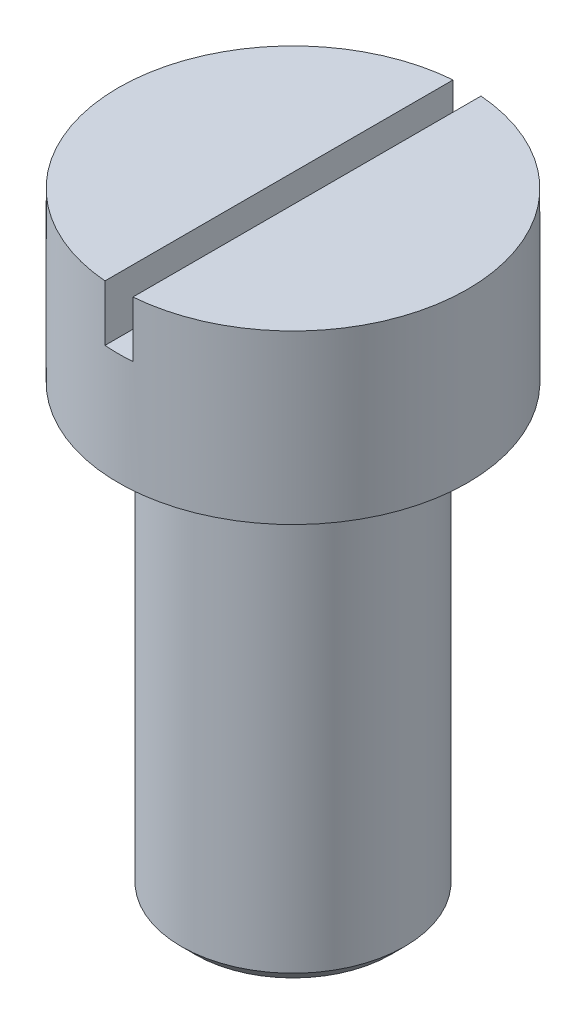
ISO-10303-21;
HEADER;
FILE_DESCRIPTION(('STEP AP214'),'2;1');
FILE_NAME('part.step','',(''),(''),'','','');
FILE_SCHEMA(('AUTOMOTIVE_DESIGN { 1 0 10303 214 1 1 1 1 }'));
ENDSEC;
DATA;
#1=APPLICATION_CONTEXT('core data for automotive mechanical design processes');
#2=APPLICATION_PROTOCOL_DEFINITION('international standard','automotive_design',2000,#1);
#3=PRODUCT_CONTEXT('',#1,'mechanical');
#4=PRODUCT('Part','Part','',(#3));
#5=PRODUCT_RELATED_PRODUCT_CATEGORY('part','',(#4));
#6=PRODUCT_DEFINITION_FORMATION('','',#4);
#7=PRODUCT_DEFINITION_CONTEXT('part definition',#1,'design');
#8=PRODUCT_DEFINITION('design','',#6,#7);
#9=PRODUCT_DEFINITION_SHAPE('','',#8);
#10=(LENGTH_UNIT() NAMED_UNIT(*) SI_UNIT(.MILLI.,.METRE.));
#11=(NAMED_UNIT(*) PLANE_ANGLE_UNIT() SI_UNIT($,.RADIAN.));
#12=(NAMED_UNIT(*) SI_UNIT($,.STERADIAN.) SOLID_ANGLE_UNIT());
#13=UNCERTAINTY_MEASURE_WITH_UNIT(LENGTH_MEASURE(1.E-05),#10,'distance_accuracy_value','');
#14=(GEOMETRIC_REPRESENTATION_CONTEXT(3) GLOBAL_UNCERTAINTY_ASSIGNED_CONTEXT((#13)) GLOBAL_UNIT_ASSIGNED_CONTEXT((#10,
#11,#12)) REPRESENTATION_CONTEXT('',''));
#15=CARTESIAN_POINT('',(0.,0.,0.));
#16=DIRECTION('',(0.,0.,1.));
#17=DIRECTION('',(1.,0.,0.));
#18=AXIS2_PLACEMENT_3D('',#15,#16,#17);
#19=CARTESIAN_POINT('',(12.5,44.,0.));
#20=DIRECTION('',(0.,-1.,0.));
#21=DIRECTION('',(1.,0.,0.));
#22=AXIS2_PLACEMENT_3D('',#19,#20,#21);
#23=PLANE('',#22);
#24=CARTESIAN_POINT('',(0.,44.,0.));
#25=DIRECTION('',(0.,1.,0.));
#26=DIRECTION('',(-1.,0.,0.));
#27=AXIS2_PLACEMENT_3D('',#24,#25,#26);
#28=CIRCLE('',#27,12.5);
#29=CARTESIAN_POINT('',(1.,44.,12.4599357943771));
#30=VERTEX_POINT('',#29);
#31=CARTESIAN_POINT('',(1.,44.,-12.4599357943771));
#32=VERTEX_POINT('',#31);
#33=EDGE_CURVE('E102',#30,#32,#28,.T.);
#34=ORIENTED_EDGE('',*,*,#33,.T.);
#35=DIRECTION('',(0.,0.,1.));
#36=VECTOR('',#35,1.);
#37=CARTESIAN_POINT('',(0.999999999999999,44.,0.));
#38=LINE('',#37,#36);
#39=EDGE_CURVE('E91',#32,#30,#38,.T.);
#40=ORIENTED_EDGE('',*,*,#39,.T.);
#41=EDGE_LOOP('',(#34,#40));
#42=FACE_BOUND('',#41,.T.);
#43=ADVANCED_FACE('F44',(#42),#23,.F.);
#44=CARTESIAN_POINT('',(0.,0.,0.));
#45=DIRECTION('',(0.,1.,0.));
#46=DIRECTION('',(-1.,0.,0.));
#47=AXIS2_PLACEMENT_3D('',#44,#45,#46);
#48=PLANE('',#47);
#49=CARTESIAN_POINT('',(0.,0.,0.));
#50=DIRECTION('',(0.,1.,0.));
#51=DIRECTION('',(-1.,0.,0.));
#52=AXIS2_PLACEMENT_3D('',#49,#50,#51);
#53=CIRCLE('',#52,7.);
#54=CARTESIAN_POINT('',(-7.,0.,0.));
#55=VERTEX_POINT('',#54);
#56=EDGE_CURVE('E92',#55,#55,#53,.F.);
#57=ORIENTED_EDGE('',*,*,#56,.T.);
#58=EDGE_LOOP('',(#57));
#59=FACE_BOUND('',#58,.T.);
#60=ADVANCED_FACE('F142',(#59),#48,.F.);
#61=CARTESIAN_POINT('',(0.,44.,0.));
#62=DIRECTION('',(0.,1.,0.));
#63=DIRECTION('',(-1.,0.,0.));
#64=AXIS2_PLACEMENT_3D('',#61,#62,#63);
#65=CYLINDRICAL_SURFACE('',#64,8.);
#66=CARTESIAN_POINT('',(0.,1.,0.));
#67=DIRECTION('',(0.,1.,0.));
#68=DIRECTION('',(-1.,0.,0.));
#69=AXIS2_PLACEMENT_3D('',#66,#67,#68);
#70=CIRCLE('',#69,8.);
#71=CARTESIAN_POINT('',(-8.,1.,0.));
#72=VERTEX_POINT('',#71);
#73=EDGE_CURVE('E115',#72,#72,#70,.T.);
#74=ORIENTED_EDGE('',*,*,#73,.T.);
#75=EDGE_LOOP('',(#74));
#76=FACE_BOUND('',#75,.T.);
#77=CARTESIAN_POINT('',(0.,32.,0.));
#78=DIRECTION('',(0.,1.,0.));
#79=DIRECTION('',(-1.,0.,0.));
#80=AXIS2_PLACEMENT_3D('',#77,#78,#79);
#81=CIRCLE('',#80,8.);
#82=CARTESIAN_POINT('',(-8.,32.,0.));
#83=VERTEX_POINT('',#82);
#84=EDGE_CURVE('E112',#83,#83,#81,.T.);
#85=ORIENTED_EDGE('',*,*,#84,.F.);
#86=EDGE_LOOP('',(#85));
#87=FACE_BOUND('',#86,.T.);
#88=ADVANCED_FACE('F147',(#76,#87),#65,.T.);
#89=CARTESIAN_POINT('',(8.,32.,0.));
#90=DIRECTION('',(0.,1.,0.));
#91=DIRECTION('',(-1.,0.,0.));
#92=AXIS2_PLACEMENT_3D('',#89,#90,#91);
#93=PLANE('',#92);
#94=CARTESIAN_POINT('',(0.,32.,0.));
#95=DIRECTION('',(0.,1.,0.));
#96=DIRECTION('',(-1.,0.,0.));
#97=AXIS2_PLACEMENT_3D('',#94,#95,#96);
#98=CIRCLE('',#97,12.5);
#99=CARTESIAN_POINT('',(-12.5,32.,0.));
#100=VERTEX_POINT('',#99);
#101=EDGE_CURVE('E106',#100,#100,#98,.T.);
#102=ORIENTED_EDGE('',*,*,#101,.F.);
#103=EDGE_LOOP('',(#102));
#104=FACE_BOUND('',#103,.T.);
#105=ORIENTED_EDGE('',*,*,#84,.T.);
#106=EDGE_LOOP('',(#105));
#107=FACE_BOUND('',#106,.T.);
#108=ADVANCED_FACE('F154',(#104,#107),#93,.F.);
#109=CARTESIAN_POINT('',(0.,44.,0.));
#110=DIRECTION('',(0.,1.,0.));
#111=DIRECTION('',(-1.,0.,0.));
#112=AXIS2_PLACEMENT_3D('',#109,#110,#111);
#113=CYLINDRICAL_SURFACE('',#112,12.5);
#114=ORIENTED_EDGE('',*,*,#33,.F.);
#115=DIRECTION('',(0.,1.,0.));
#116=VECTOR('',#115,1.);
#117=CARTESIAN_POINT('',(1.,44.,12.4599357943771));
#118=LINE('',#117,#116);
#119=CARTESIAN_POINT('',(1.,40.,12.4599357943771));
#120=VERTEX_POINT('',#119);
#121=EDGE_CURVE('E99',#30,#120,#118,.F.);
#122=ORIENTED_EDGE('',*,*,#121,.T.);
#123=CARTESIAN_POINT('',(0.,40.,0.));
#124=DIRECTION('',(0.,-1.,0.));
#125=DIRECTION('',(0.,0.,-1.));
#126=AXIS2_PLACEMENT_3D('',#123,#124,#125);
#127=CIRCLE('',#126,12.5);
#128=CARTESIAN_POINT('',(-1.,40.,12.4599357943771));
#129=VERTEX_POINT('',#128);
#130=EDGE_CURVE('E11',#120,#129,#127,.T.);
#131=ORIENTED_EDGE('',*,*,#130,.T.);
#132=DIRECTION('',(0.,1.,0.));
#133=VECTOR('',#132,1.);
#134=CARTESIAN_POINT('',(-1.,44.,12.4599357943771));
#135=LINE('',#134,#133);
#136=CARTESIAN_POINT('',(-1.,44.,12.4599357943771));
#137=VERTEX_POINT('',#136);
#138=EDGE_CURVE('E86',#129,#137,#135,.T.);
#139=ORIENTED_EDGE('',*,*,#138,.T.);
#140=CARTESIAN_POINT('',(-1.,44.,-12.4599357943771));
#141=VERTEX_POINT('',#140);
#142=EDGE_CURVE('E97',#141,#137,#28,.T.);
#143=ORIENTED_EDGE('',*,*,#142,.F.);
#144=DIRECTION('',(0.,1.,0.));
#145=VECTOR('',#144,1.);
#146=CARTESIAN_POINT('',(-1.,44.,-12.4599357943771));
#147=LINE('',#146,#145);
#148=CARTESIAN_POINT('',(-1.,40.,-12.4599357943771));
#149=VERTEX_POINT('',#148);
#150=EDGE_CURVE('E60',#141,#149,#147,.F.);
#151=ORIENTED_EDGE('',*,*,#150,.T.);
#152=CARTESIAN_POINT('',(1.,40.,-12.4599357943771));
#153=VERTEX_POINT('',#152);
#154=EDGE_CURVE('E49',#149,#153,#127,.T.);
#155=ORIENTED_EDGE('',*,*,#154,.T.);
#156=DIRECTION('',(0.,1.,0.));
#157=VECTOR('',#156,1.);
#158=CARTESIAN_POINT('',(1.,44.,-12.4599357943771));
#159=LINE('',#158,#157);
#160=EDGE_CURVE('E103',#153,#32,#159,.T.);
#161=ORIENTED_EDGE('',*,*,#160,.T.);
#162=EDGE_LOOP('',(#114,#122,#131,#139,#143,#151,#155,#161));
#163=FACE_BOUND('',#162,.T.);
#164=ORIENTED_EDGE('',*,*,#101,.T.);
#165=EDGE_LOOP('',(#164));
#166=FACE_BOUND('',#165,.T.);
#167=ADVANCED_FACE('F95',(#163,#166),#113,.T.);
#168=ORIENTED_EDGE('',*,*,#142,.T.);
#169=DIRECTION('',(0.,0.,-1.));
#170=VECTOR('',#169,1.);
#171=CARTESIAN_POINT('',(-1.,44.,0.));
#172=LINE('',#171,#170);
#173=EDGE_CURVE('E83',#137,#141,#172,.T.);
#174=ORIENTED_EDGE('',*,*,#173,.T.);
#175=EDGE_LOOP('',(#168,#174));
#176=FACE_BOUND('',#175,.T.);
#177=ADVANCED_FACE('F101',(#176),#23,.F.);
#178=CARTESIAN_POINT('',(0.,1.,0.));
#179=DIRECTION('',(0.,1.,0.));
#180=DIRECTION('',(-1.,0.,0.));
#181=AXIS2_PLACEMENT_3D('',#178,#179,#180);
#182=CONICAL_SURFACE('',#181,8.,0.785398163397448);
#183=ORIENTED_EDGE('',*,*,#56,.F.);
#184=EDGE_LOOP('',(#183));
#185=FACE_BOUND('',#184,.T.);
#186=ORIENTED_EDGE('',*,*,#73,.F.);
#187=EDGE_LOOP('',(#186));
#188=FACE_BOUND('',#187,.T.);
#189=ADVANCED_FACE('F47',(#185,#188),#182,.T.);
#190=CARTESIAN_POINT('',(0.,40.,0.));
#191=DIRECTION('',(0.,-1.,0.));
#192=DIRECTION('',(0.,0.,-1.));
#193=AXIS2_PLACEMENT_3D('',#190,#191,#192);
#194=PLANE('',#193);
#195=DIRECTION('',(0.,0.,-1.));
#196=VECTOR('',#195,1.);
#197=CARTESIAN_POINT('',(1.,40.,12.5));
#198=LINE('',#197,#196);
#199=EDGE_CURVE('E125',#120,#153,#198,.T.);
#200=ORIENTED_EDGE('',*,*,#199,.T.);
#201=ORIENTED_EDGE('',*,*,#154,.F.);
#202=DIRECTION('',(0.,0.,1.));
#203=VECTOR('',#202,1.);
#204=CARTESIAN_POINT('',(-1.,40.,12.5));
#205=LINE('',#204,#203);
#206=EDGE_CURVE('E128',#149,#129,#205,.T.);
#207=ORIENTED_EDGE('',*,*,#206,.T.);
#208=ORIENTED_EDGE('',*,*,#130,.F.);
#209=EDGE_LOOP('',(#200,#201,#207,#208));
#210=FACE_BOUND('',#209,.T.);
#211=ADVANCED_FACE('F127',(#210),#194,.F.);
#212=CARTESIAN_POINT('',(1.,40.,12.5));
#213=DIRECTION('',(1.,0.,0.));
#214=DIRECTION('',(0.,1.,0.));
#215=AXIS2_PLACEMENT_3D('',#212,#213,#214);
#216=PLANE('',#215);
#217=ORIENTED_EDGE('',*,*,#199,.F.);
#218=ORIENTED_EDGE('',*,*,#121,.F.);
#219=ORIENTED_EDGE('',*,*,#39,.F.);
#220=ORIENTED_EDGE('',*,*,#160,.F.);
#221=EDGE_LOOP('',(#217,#218,#219,#220));
#222=FACE_BOUND('',#221,.T.);
#223=ADVANCED_FACE('F124',(#222),#216,.F.);
#224=CARTESIAN_POINT('',(-1.,40.,12.5));
#225=DIRECTION('',(-1.,0.,0.));
#226=DIRECTION('',(0.,-1.,0.));
#227=AXIS2_PLACEMENT_3D('',#224,#225,#226);
#228=PLANE('',#227);
#229=ORIENTED_EDGE('',*,*,#206,.F.);
#230=ORIENTED_EDGE('',*,*,#150,.F.);
#231=ORIENTED_EDGE('',*,*,#173,.F.);
#232=ORIENTED_EDGE('',*,*,#138,.F.);
#233=EDGE_LOOP('',(#229,#230,#231,#232));
#234=FACE_BOUND('',#233,.T.);
#235=ADVANCED_FACE('F85',(#234),#228,.F.);
#236=CLOSED_SHELL('',(#43,#60,#88,#108,#167,#177,#189,#211,#223,#235));
#237=MANIFOLD_SOLID_BREP('B2',#236);
#238=ADVANCED_BREP_SHAPE_REPRESENTATION('',(#18,#237),#14);
#239=SHAPE_DEFINITION_REPRESENTATION(#9,#238);
ENDSEC;
END-ISO-10303-21;
